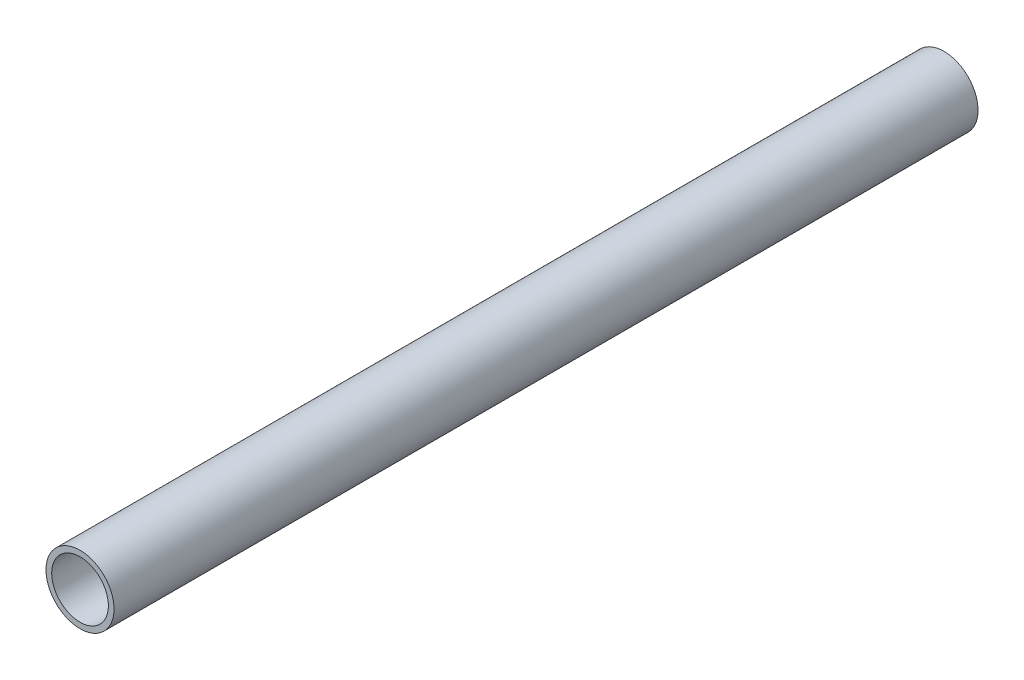
ISO-10303-21;
HEADER;
FILE_DESCRIPTION(('STEP AP214'),'2;1');
FILE_NAME('part.step','',(''),(''),'','','');
FILE_SCHEMA(('AUTOMOTIVE_DESIGN { 1 0 10303 214 1 1 1 1 }'));
ENDSEC;
DATA;
#1=APPLICATION_CONTEXT('core data for automotive mechanical design processes');
#2=APPLICATION_PROTOCOL_DEFINITION('international standard','automotive_design',2000,#1);
#3=PRODUCT_CONTEXT('',#1,'mechanical');
#4=PRODUCT('Part','Part','',(#3));
#5=PRODUCT_RELATED_PRODUCT_CATEGORY('part','',(#4));
#6=PRODUCT_DEFINITION_FORMATION('','',#4);
#7=PRODUCT_DEFINITION_CONTEXT('part definition',#1,'design');
#8=PRODUCT_DEFINITION('design','',#6,#7);
#9=PRODUCT_DEFINITION_SHAPE('','',#8);
#10=(LENGTH_UNIT() NAMED_UNIT(*) SI_UNIT(.MILLI.,.METRE.));
#11=(NAMED_UNIT(*) PLANE_ANGLE_UNIT() SI_UNIT($,.RADIAN.));
#12=(NAMED_UNIT(*) SI_UNIT($,.STERADIAN.) SOLID_ANGLE_UNIT());
#13=UNCERTAINTY_MEASURE_WITH_UNIT(LENGTH_MEASURE(1.E-05),#10,'distance_accuracy_value','');
#14=(GEOMETRIC_REPRESENTATION_CONTEXT(3) GLOBAL_UNCERTAINTY_ASSIGNED_CONTEXT((#13)) GLOBAL_UNIT_ASSIGNED_CONTEXT((#10,
#11,#12)) REPRESENTATION_CONTEXT('',''));
#15=CARTESIAN_POINT('',(0.,0.,0.));
#16=DIRECTION('',(0.,0.,1.));
#17=DIRECTION('',(1.,0.,0.));
#18=AXIS2_PLACEMENT_3D('',#15,#16,#17);
#19=CARTESIAN_POINT('',(0.,0.,76.2));
#20=DIRECTION('',(0.,0.,1.));
#21=DIRECTION('',(1.,0.,0.));
#22=AXIS2_PLACEMENT_3D('',#19,#20,#21);
#23=PLANE('',#22);
#24=CARTESIAN_POINT('',(0.,0.,76.2));
#25=DIRECTION('',(0.,0.,1.));
#26=DIRECTION('',(1.,0.,0.));
#27=AXIS2_PLACEMENT_3D('',#24,#25,#26);
#28=CIRCLE('',#27,3.);
#29=CARTESIAN_POINT('',(-3.,0.,76.2));
#30=VERTEX_POINT('',#29);
#31=EDGE_CURVE('E10',#30,#30,#28,.T.);
#32=ORIENTED_EDGE('',*,*,#31,.T.);
#33=EDGE_LOOP('',(#32));
#34=FACE_BOUND('',#33,.T.);
#35=CARTESIAN_POINT('',(0.,0.,76.2));
#36=DIRECTION('',(0.,0.,1.));
#37=DIRECTION('',(1.,0.,0.));
#38=AXIS2_PLACEMENT_3D('',#35,#36,#37);
#39=CIRCLE('',#38,2.5);
#40=CARTESIAN_POINT('',(-2.5,0.,76.2));
#41=VERTEX_POINT('',#40);
#42=EDGE_CURVE('E50',#41,#41,#39,.T.);
#43=ORIENTED_EDGE('',*,*,#42,.F.);
#44=EDGE_LOOP('',(#43));
#45=FACE_BOUND('',#44,.T.);
#46=ADVANCED_FACE('F37',(#34,#45),#23,.T.);
#47=CARTESIAN_POINT('',(0.,0.,0.));
#48=DIRECTION('',(0.,0.,1.));
#49=DIRECTION('',(1.,0.,0.));
#50=AXIS2_PLACEMENT_3D('',#47,#48,#49);
#51=PLANE('',#50);
#52=CARTESIAN_POINT('',(0.,0.,0.));
#53=DIRECTION('',(0.,0.,1.));
#54=DIRECTION('',(1.,0.,0.));
#55=AXIS2_PLACEMENT_3D('',#52,#53,#54);
#56=CIRCLE('',#55,3.);
#57=CARTESIAN_POINT('',(-3.,0.,0.));
#58=VERTEX_POINT('',#57);
#59=EDGE_CURVE('E41',#58,#58,#56,.T.);
#60=ORIENTED_EDGE('',*,*,#59,.F.);
#61=EDGE_LOOP('',(#60));
#62=FACE_BOUND('',#61,.T.);
#63=CARTESIAN_POINT('',(0.,0.,0.));
#64=DIRECTION('',(0.,0.,1.));
#65=DIRECTION('',(1.,0.,0.));
#66=AXIS2_PLACEMENT_3D('',#63,#64,#65);
#67=CIRCLE('',#66,2.5);
#68=CARTESIAN_POINT('',(-2.5,0.,0.));
#69=VERTEX_POINT('',#68);
#70=EDGE_CURVE('E52',#69,#69,#67,.T.);
#71=ORIENTED_EDGE('',*,*,#70,.T.);
#72=EDGE_LOOP('',(#71));
#73=FACE_BOUND('',#72,.T.);
#74=ADVANCED_FACE('F64',(#62,#73),#51,.F.);
#75=CARTESIAN_POINT('',(0.,0.,76.2));
#76=DIRECTION('',(0.,0.,-1.));
#77=DIRECTION('',(-1.,0.,0.));
#78=AXIS2_PLACEMENT_3D('',#75,#76,#77);
#79=CYLINDRICAL_SURFACE('',#78,3.);
#80=CARTESIAN_POINT('',(-3.,0.,76.2));
#81=CARTESIAN_POINT('',(-3.,0.,75.40625));
#82=CARTESIAN_POINT('',(-3.,0.,74.6125));
#83=CARTESIAN_POINT('',(-3.,0.,73.025));
#84=CARTESIAN_POINT('',(-3.,0.,72.23125));
#85=CARTESIAN_POINT('',(-3.,0.,70.64375));
#86=CARTESIAN_POINT('',(-3.,0.,69.85));
#87=CARTESIAN_POINT('',(-3.,0.,68.2625));
#88=CARTESIAN_POINT('',(-3.,0.,67.46875));
#89=CARTESIAN_POINT('',(-3.,0.,65.88125));
#90=CARTESIAN_POINT('',(-3.,0.,65.0875));
#91=CARTESIAN_POINT('',(-3.,0.,63.5));
#92=CARTESIAN_POINT('',(-3.,0.,62.70625));
#93=CARTESIAN_POINT('',(-3.,0.,61.11875));
#94=CARTESIAN_POINT('',(-3.,0.,60.325));
#95=CARTESIAN_POINT('',(-3.,0.,58.7375));
#96=CARTESIAN_POINT('',(-3.,0.,57.94375));
#97=CARTESIAN_POINT('',(-3.,0.,56.35625));
#98=CARTESIAN_POINT('',(-3.,0.,55.5625));
#99=CARTESIAN_POINT('',(-3.,0.,53.975));
#100=CARTESIAN_POINT('',(-3.,0.,53.18125));
#101=CARTESIAN_POINT('',(-3.,0.,51.59375));
#102=CARTESIAN_POINT('',(-3.,0.,50.8));
#103=CARTESIAN_POINT('',(-3.,0.,49.2125));
#104=CARTESIAN_POINT('',(-3.,0.,48.41875));
#105=CARTESIAN_POINT('',(-3.,0.,46.83125));
#106=CARTESIAN_POINT('',(-3.,0.,46.0375));
#107=CARTESIAN_POINT('',(-3.,0.,44.45));
#108=CARTESIAN_POINT('',(-3.,0.,43.65625));
#109=CARTESIAN_POINT('',(-3.,0.,42.06875));
#110=CARTESIAN_POINT('',(-3.,0.,41.275));
#111=CARTESIAN_POINT('',(-3.,0.,39.6875));
#112=CARTESIAN_POINT('',(-3.,0.,38.89375));
#113=CARTESIAN_POINT('',(-3.,0.,37.30625));
#114=CARTESIAN_POINT('',(-3.,0.,36.5125));
#115=CARTESIAN_POINT('',(-3.,0.,34.925));
#116=CARTESIAN_POINT('',(-3.,0.,34.13125));
#117=CARTESIAN_POINT('',(-3.,0.,32.54375));
#118=CARTESIAN_POINT('',(-3.,0.,31.75));
#119=CARTESIAN_POINT('',(-3.,0.,30.1625));
#120=CARTESIAN_POINT('',(-3.,0.,29.36875));
#121=CARTESIAN_POINT('',(-3.,0.,27.78125));
#122=CARTESIAN_POINT('',(-3.,0.,26.9875));
#123=CARTESIAN_POINT('',(-3.,0.,25.4));
#124=CARTESIAN_POINT('',(-3.,0.,24.60625));
#125=CARTESIAN_POINT('',(-3.,0.,23.01875));
#126=CARTESIAN_POINT('',(-3.,0.,22.225));
#127=CARTESIAN_POINT('',(-3.,0.,20.6375));
#128=CARTESIAN_POINT('',(-3.,0.,19.84375));
#129=CARTESIAN_POINT('',(-3.,0.,18.25625));
#130=CARTESIAN_POINT('',(-3.,0.,17.4625));
#131=CARTESIAN_POINT('',(-3.,0.,15.875));
#132=CARTESIAN_POINT('',(-3.,0.,15.08125));
#133=CARTESIAN_POINT('',(-3.,0.,13.49375));
#134=CARTESIAN_POINT('',(-3.,0.,12.7));
#135=CARTESIAN_POINT('',(-3.,0.,11.1125));
#136=CARTESIAN_POINT('',(-3.,0.,10.31875));
#137=CARTESIAN_POINT('',(-3.,0.,8.73125));
#138=CARTESIAN_POINT('',(-3.,0.,7.93750000000001));
#139=CARTESIAN_POINT('',(-3.,0.,6.35));
#140=CARTESIAN_POINT('',(-3.,0.,5.55625));
#141=CARTESIAN_POINT('',(-3.,0.,3.96875));
#142=CARTESIAN_POINT('',(-3.,0.,3.175));
#143=CARTESIAN_POINT('',(-3.,0.,1.5875));
#144=CARTESIAN_POINT('',(-3.,0.,0.793750000000001));
#145=CARTESIAN_POINT('',(-3.,0.,0.));
#146=B_SPLINE_CURVE_WITH_KNOTS('',3,(#80,#81,#82,#83,#84,#85,#86,#87,#88,#89,#90,#91,#92,#93,
#94,#95,#96,#97,#98,#99,#100,#101,#102,#103,#104,#105,#106,#107,#108,#109,#110,#111,#112,#113,
#114,#115,#116,#117,#118,#119,#120,#121,#122,#123,#124,#125,#126,#127,#128,#129,#130,#131,#132,
#133,#134,#135,#136,#137,#138,#139,#140,#141,#142,#143,#144,#145),.UNSPECIFIED.,.F.,.F.,(4,2,2,
2,2,2,2,2,2,2,2,2,2,2,2,2,2,2,2,2,2,2,2,2,2,2,2,2,2,2,2,2,4),(0.,2.38124999999999,
4.76249999999999,7.14374999999999,9.52499999999999,11.90625,14.2875,16.66875,19.05,21.43125,
23.8125,26.19375,28.575,30.95625,33.3375,35.71875,38.1,40.48125,42.8625,45.24375,47.625,
50.00625,52.3875,54.76875,57.15,59.53125,61.9125,64.29375,66.675,69.05625,71.4375,73.81875,
76.2),.UNSPECIFIED.);
#147=EDGE_CURVE('BSEAM39',#30,#58,#146,.T.);
#148=ORIENTED_EDGE('',*,*,#31,.F.);
#149=ORIENTED_EDGE('',*,*,#59,.T.);
#150=ORIENTED_EDGE('',*,*,#147,.T.);
#151=ORIENTED_EDGE('',*,*,#147,.F.);
#152=EDGE_LOOP('',(#148,#150,#149,#151));
#153=FACE_BOUND('',#152,.T.);
#154=ADVANCED_FACE('F39',(#153),#79,.T.);
#155=CARTESIAN_POINT('',(0.,0.,76.2));
#156=DIRECTION('',(0.,0.,-1.));
#157=DIRECTION('',(-1.,0.,0.));
#158=AXIS2_PLACEMENT_3D('',#155,#156,#157);
#159=CYLINDRICAL_SURFACE('',#158,2.5);
#160=CARTESIAN_POINT('',(-2.5,0.,76.2));
#161=CARTESIAN_POINT('',(-2.5,0.,75.40625));
#162=CARTESIAN_POINT('',(-2.5,0.,74.6125));
#163=CARTESIAN_POINT('',(-2.5,0.,73.025));
#164=CARTESIAN_POINT('',(-2.5,0.,72.23125));
#165=CARTESIAN_POINT('',(-2.5,0.,70.64375));
#166=CARTESIAN_POINT('',(-2.5,0.,69.85));
#167=CARTESIAN_POINT('',(-2.5,0.,68.2625));
#168=CARTESIAN_POINT('',(-2.5,0.,67.46875));
#169=CARTESIAN_POINT('',(-2.5,0.,65.88125));
#170=CARTESIAN_POINT('',(-2.5,0.,65.0875));
#171=CARTESIAN_POINT('',(-2.5,0.,63.5));
#172=CARTESIAN_POINT('',(-2.5,0.,62.70625));
#173=CARTESIAN_POINT('',(-2.5,0.,61.11875));
#174=CARTESIAN_POINT('',(-2.5,0.,60.325));
#175=CARTESIAN_POINT('',(-2.5,0.,58.7375));
#176=CARTESIAN_POINT('',(-2.5,0.,57.94375));
#177=CARTESIAN_POINT('',(-2.5,0.,56.35625));
#178=CARTESIAN_POINT('',(-2.5,0.,55.5625));
#179=CARTESIAN_POINT('',(-2.5,0.,53.975));
#180=CARTESIAN_POINT('',(-2.5,0.,53.18125));
#181=CARTESIAN_POINT('',(-2.5,0.,51.59375));
#182=CARTESIAN_POINT('',(-2.5,0.,50.8));
#183=CARTESIAN_POINT('',(-2.5,0.,49.2125));
#184=CARTESIAN_POINT('',(-2.5,0.,48.41875));
#185=CARTESIAN_POINT('',(-2.5,0.,46.83125));
#186=CARTESIAN_POINT('',(-2.5,0.,46.0375));
#187=CARTESIAN_POINT('',(-2.5,0.,44.45));
#188=CARTESIAN_POINT('',(-2.5,0.,43.65625));
#189=CARTESIAN_POINT('',(-2.5,0.,42.06875));
#190=CARTESIAN_POINT('',(-2.5,0.,41.275));
#191=CARTESIAN_POINT('',(-2.5,0.,39.6875));
#192=CARTESIAN_POINT('',(-2.5,0.,38.89375));
#193=CARTESIAN_POINT('',(-2.5,0.,37.30625));
#194=CARTESIAN_POINT('',(-2.5,0.,36.5125));
#195=CARTESIAN_POINT('',(-2.5,0.,34.925));
#196=CARTESIAN_POINT('',(-2.5,0.,34.13125));
#197=CARTESIAN_POINT('',(-2.5,0.,32.54375));
#198=CARTESIAN_POINT('',(-2.5,0.,31.75));
#199=CARTESIAN_POINT('',(-2.5,0.,30.1625));
#200=CARTESIAN_POINT('',(-2.5,0.,29.36875));
#201=CARTESIAN_POINT('',(-2.5,0.,27.78125));
#202=CARTESIAN_POINT('',(-2.5,0.,26.9875));
#203=CARTESIAN_POINT('',(-2.5,0.,25.4));
#204=CARTESIAN_POINT('',(-2.5,0.,24.60625));
#205=CARTESIAN_POINT('',(-2.5,0.,23.01875));
#206=CARTESIAN_POINT('',(-2.5,0.,22.225));
#207=CARTESIAN_POINT('',(-2.5,0.,20.6375));
#208=CARTESIAN_POINT('',(-2.5,0.,19.84375));
#209=CARTESIAN_POINT('',(-2.5,0.,18.25625));
#210=CARTESIAN_POINT('',(-2.5,0.,17.4625));
#211=CARTESIAN_POINT('',(-2.5,0.,15.875));
#212=CARTESIAN_POINT('',(-2.5,0.,15.08125));
#213=CARTESIAN_POINT('',(-2.5,0.,13.49375));
#214=CARTESIAN_POINT('',(-2.5,0.,12.7));
#215=CARTESIAN_POINT('',(-2.5,0.,11.1125));
#216=CARTESIAN_POINT('',(-2.5,0.,10.31875));
#217=CARTESIAN_POINT('',(-2.5,0.,8.73125));
#218=CARTESIAN_POINT('',(-2.5,0.,7.93750000000001));
#219=CARTESIAN_POINT('',(-2.5,0.,6.35));
#220=CARTESIAN_POINT('',(-2.5,0.,5.55625));
#221=CARTESIAN_POINT('',(-2.5,0.,3.96875));
#222=CARTESIAN_POINT('',(-2.5,0.,3.175));
#223=CARTESIAN_POINT('',(-2.5,0.,1.5875));
#224=CARTESIAN_POINT('',(-2.5,0.,0.793750000000001));
#225=CARTESIAN_POINT('',(-2.5,0.,0.));
#226=B_SPLINE_CURVE_WITH_KNOTS('',3,(#160,#161,#162,#163,#164,#165,#166,#167,#168,#169,#170,
#171,#172,#173,#174,#175,#176,#177,#178,#179,#180,#181,#182,#183,#184,#185,#186,#187,#188,#189,
#190,#191,#192,#193,#194,#195,#196,#197,#198,#199,#200,#201,#202,#203,#204,#205,#206,#207,#208,
#209,#210,#211,#212,#213,#214,#215,#216,#217,#218,#219,#220,#221,#222,#223,#224,#225),
.UNSPECIFIED.,.F.,.F.,(4,2,2,2,2,2,2,2,2,2,2,2,2,2,2,2,2,2,2,2,2,2,2,2,2,2,2,2,2,2,2,2,4),(0.,
2.38125,4.7625,7.14375,9.52500000000001,11.90625,14.2875,16.66875,19.05,21.43125,23.8125,
26.19375,28.575,30.95625,33.3375,35.71875,38.1,40.48125,42.8625,45.24375,47.625,50.00625,
52.3875,54.76875,57.15,59.53125,61.9125,64.29375,66.675,69.05625,71.4375,73.81875,76.2),.UNSPECIFIED.);
#227=EDGE_CURVE('BSEAM60',#41,#69,#226,.T.);
#228=ORIENTED_EDGE('',*,*,#42,.T.);
#229=ORIENTED_EDGE('',*,*,#70,.F.);
#230=ORIENTED_EDGE('',*,*,#227,.T.);
#231=ORIENTED_EDGE('',*,*,#227,.F.);
#232=EDGE_LOOP('',(#228,#230,#229,#231));
#233=FACE_BOUND('',#232,.T.);
#234=ADVANCED_FACE('F60',(#233),#159,.F.);
#235=CLOSED_SHELL('',(#46,#74,#154,#234));
#236=MANIFOLD_SOLID_BREP('B2',#235);
#237=ADVANCED_BREP_SHAPE_REPRESENTATION('',(#18,#236),#14);
#238=SHAPE_DEFINITION_REPRESENTATION(#9,#237);
ENDSEC;
END-ISO-10303-21;
